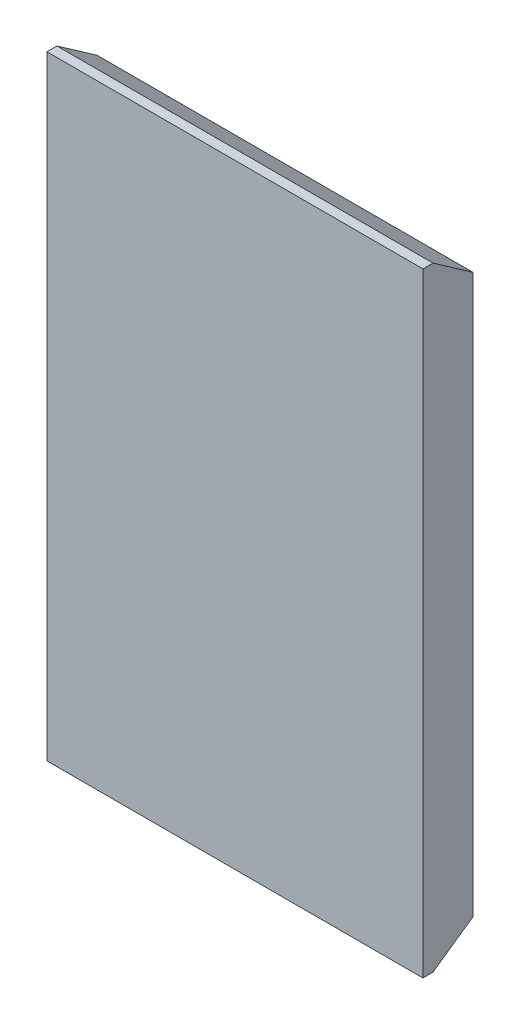
ISO-10303-21;
HEADER;
FILE_DESCRIPTION(('STEP AP214'),'2;1');
FILE_NAME('part.step','',(''),(''),'','','');
FILE_SCHEMA(('AUTOMOTIVE_DESIGN { 1 0 10303 214 1 1 1 1 }'));
ENDSEC;
DATA;
#1=APPLICATION_CONTEXT('core data for automotive mechanical design processes');
#2=APPLICATION_PROTOCOL_DEFINITION('international standard','automotive_design',2000,#1);
#3=PRODUCT_CONTEXT('',#1,'mechanical');
#4=PRODUCT('Part','Part','',(#3));
#5=PRODUCT_RELATED_PRODUCT_CATEGORY('part','',(#4));
#6=PRODUCT_DEFINITION_FORMATION('','',#4);
#7=PRODUCT_DEFINITION_CONTEXT('part definition',#1,'design');
#8=PRODUCT_DEFINITION('design','',#6,#7);
#9=PRODUCT_DEFINITION_SHAPE('','',#8);
#10=(LENGTH_UNIT() NAMED_UNIT(*) SI_UNIT(.MILLI.,.METRE.));
#11=(NAMED_UNIT(*) PLANE_ANGLE_UNIT() SI_UNIT($,.RADIAN.));
#12=(NAMED_UNIT(*) SI_UNIT($,.STERADIAN.) SOLID_ANGLE_UNIT());
#13=UNCERTAINTY_MEASURE_WITH_UNIT(LENGTH_MEASURE(1.E-05),#10,'distance_accuracy_value','');
#14=(GEOMETRIC_REPRESENTATION_CONTEXT(3) GLOBAL_UNCERTAINTY_ASSIGNED_CONTEXT((#13)) GLOBAL_UNIT_ASSIGNED_CONTEXT((#10,
#11,#12)) REPRESENTATION_CONTEXT('',''));
#15=CARTESIAN_POINT('',(0.,0.,0.));
#16=DIRECTION('',(0.,0.,1.));
#17=DIRECTION('',(1.,0.,0.));
#18=AXIS2_PLACEMENT_3D('',#15,#16,#17);
#19=CARTESIAN_POINT('',(75.,122.5,-20.));
#20=DIRECTION('',(1.,0.,0.));
#21=DIRECTION('',(0.,1.,0.));
#22=AXIS2_PLACEMENT_3D('',#19,#20,#21);
#23=PLANE('',#22);
#24=DIRECTION('',(0.,0.,1.));
#25=VECTOR('',#24,1.);
#26=CARTESIAN_POINT('',(75.,-122.5,-20.));
#27=LINE('',#26,#25);
#28=CARTESIAN_POINT('',(75.,-122.5,-3.99999999999996));
#29=VERTEX_POINT('',#28);
#30=CARTESIAN_POINT('',(75.,-122.5,0.));
#31=VERTEX_POINT('',#30);
#32=EDGE_CURVE('E122',#29,#31,#27,.T.);
#33=ORIENTED_EDGE('',*,*,#32,.F.);
#34=DIRECTION('',(0.,0.573576436351044,-0.819152044288993));
#35=VECTOR('',#34,1.);
#36=CARTESIAN_POINT('',(75.,-34.3799265911078,-129.848507192879));
#37=LINE('',#36,#35);
#38=CARTESIAN_POINT('',(75.,-111.296679388645,-20.));
#39=VERTEX_POINT('',#38);
#40=EDGE_CURVE('E61',#29,#39,#37,.T.);
#41=ORIENTED_EDGE('',*,*,#40,.T.);
#42=DIRECTION('',(0.,1.,0.));
#43=VECTOR('',#42,1.);
#44=CARTESIAN_POINT('',(75.,122.5,-20.));
#45=LINE('',#44,#43);
#46=CARTESIAN_POINT('',(75.,111.296679388645,-20.));
#47=VERTEX_POINT('',#46);
#48=EDGE_CURVE('E121',#39,#47,#45,.T.);
#49=ORIENTED_EDGE('',*,*,#48,.T.);
#50=DIRECTION('',(0.,0.573576436351044,0.819152044288993));
#51=VECTOR('',#50,1.);
#52=CARTESIAN_POINT('',(75.,114.982459033713,-14.7361611466054));
#53=LINE('',#52,#51);
#54=CARTESIAN_POINT('',(75.,122.5,-3.99999999999996));
#55=VERTEX_POINT('',#54);
#56=EDGE_CURVE('E96',#47,#55,#53,.T.);
#57=ORIENTED_EDGE('',*,*,#56,.T.);
#58=DIRECTION('',(0.,0.,1.));
#59=VECTOR('',#58,1.);
#60=CARTESIAN_POINT('',(75.,122.5,-20.));
#61=LINE('',#60,#59);
#62=CARTESIAN_POINT('',(75.,122.5,0.));
#63=VERTEX_POINT('',#62);
#64=EDGE_CURVE('E90',#55,#63,#61,.T.);
#65=ORIENTED_EDGE('',*,*,#64,.T.);
#66=DIRECTION('',(0.,1.,0.));
#67=VECTOR('',#66,1.);
#68=CARTESIAN_POINT('',(75.,122.5,0.));
#69=LINE('',#68,#67);
#70=EDGE_CURVE('E93',#31,#63,#69,.T.);
#71=ORIENTED_EDGE('',*,*,#70,.F.);
#72=EDGE_LOOP('',(#33,#41,#49,#57,#65,#71));
#73=FACE_BOUND('',#72,.T.);
#74=ADVANCED_FACE('F39',(#73),#23,.T.);
#75=CARTESIAN_POINT('',(-75.,-122.5,-20.));
#76=DIRECTION('',(0.,-1.,0.));
#77=DIRECTION('',(0.,0.,-1.));
#78=AXIS2_PLACEMENT_3D('',#75,#76,#77);
#79=PLANE('',#78);
#80=DIRECTION('',(0.,0.,1.));
#81=VECTOR('',#80,1.);
#82=CARTESIAN_POINT('',(-75.,-122.5,-20.));
#83=LINE('',#82,#81);
#84=CARTESIAN_POINT('',(-75.,-122.5,-3.99999999999996));
#85=VERTEX_POINT('',#84);
#86=CARTESIAN_POINT('',(-75.,-122.5,0.));
#87=VERTEX_POINT('',#86);
#88=EDGE_CURVE('E125',#85,#87,#83,.T.);
#89=ORIENTED_EDGE('',*,*,#88,.F.);
#90=DIRECTION('',(1.,0.,0.));
#91=VECTOR('',#90,1.);
#92=CARTESIAN_POINT('',(75.,-122.5,-3.99999999999996));
#93=LINE('',#92,#91);
#94=EDGE_CURVE('E135',#85,#29,#93,.T.);
#95=ORIENTED_EDGE('',*,*,#94,.T.);
#96=ORIENTED_EDGE('',*,*,#32,.T.);
#97=DIRECTION('',(1.,0.,0.));
#98=VECTOR('',#97,1.);
#99=CARTESIAN_POINT('',(-75.,-122.5,0.));
#100=LINE('',#99,#98);
#101=EDGE_CURVE('E114',#87,#31,#100,.T.);
#102=ORIENTED_EDGE('',*,*,#101,.F.);
#103=EDGE_LOOP('',(#89,#95,#96,#102));
#104=FACE_BOUND('',#103,.T.);
#105=ADVANCED_FACE('F141',(#104),#79,.T.);
#106=CARTESIAN_POINT('',(-75.,122.5,-20.));
#107=DIRECTION('',(-1.,0.,0.));
#108=DIRECTION('',(0.,-1.,0.));
#109=AXIS2_PLACEMENT_3D('',#106,#107,#108);
#110=PLANE('',#109);
#111=DIRECTION('',(0.,-1.,0.));
#112=VECTOR('',#111,1.);
#113=CARTESIAN_POINT('',(-75.,122.5,-20.));
#114=LINE('',#113,#112);
#115=CARTESIAN_POINT('',(-75.,111.296679388645,-20.));
#116=VERTEX_POINT('',#115);
#117=CARTESIAN_POINT('',(-75.,-111.296679388645,-20.));
#118=VERTEX_POINT('',#117);
#119=EDGE_CURVE('E101',#116,#118,#114,.T.);
#120=ORIENTED_EDGE('',*,*,#119,.T.);
#121=DIRECTION('',(0.,-0.573576436351044,0.819152044288993));
#122=VECTOR('',#121,1.);
#123=CARTESIAN_POINT('',(-75.,-34.3799265911078,-129.848507192879));
#124=LINE('',#123,#122);
#125=EDGE_CURVE('E11',#118,#85,#124,.T.);
#126=ORIENTED_EDGE('',*,*,#125,.T.);
#127=ORIENTED_EDGE('',*,*,#88,.T.);
#128=DIRECTION('',(0.,-1.,0.));
#129=VECTOR('',#128,1.);
#130=CARTESIAN_POINT('',(-75.,122.5,0.));
#131=LINE('',#130,#129);
#132=CARTESIAN_POINT('',(-75.,122.5,0.));
#133=VERTEX_POINT('',#132);
#134=EDGE_CURVE('E110',#133,#87,#131,.T.);
#135=ORIENTED_EDGE('',*,*,#134,.F.);
#136=DIRECTION('',(0.,0.,1.));
#137=VECTOR('',#136,1.);
#138=CARTESIAN_POINT('',(-75.,122.5,-20.));
#139=LINE('',#138,#137);
#140=CARTESIAN_POINT('',(-75.,122.5,-3.99999999999996));
#141=VERTEX_POINT('',#140);
#142=EDGE_CURVE('E100',#141,#133,#139,.T.);
#143=ORIENTED_EDGE('',*,*,#142,.F.);
#144=DIRECTION('',(0.,-0.573576436351044,-0.819152044288993));
#145=VECTOR('',#144,1.);
#146=CARTESIAN_POINT('',(-75.,114.982459033713,-14.7361611466054));
#147=LINE('',#146,#145);
#148=EDGE_CURVE('E129',#141,#116,#147,.T.);
#149=ORIENTED_EDGE('',*,*,#148,.T.);
#150=EDGE_LOOP('',(#120,#126,#127,#135,#143,#149));
#151=FACE_BOUND('',#150,.T.);
#152=ADVANCED_FACE('F145',(#151),#110,.T.);
#153=CARTESIAN_POINT('',(-75.,122.5,-20.));
#154=DIRECTION('',(0.,1.,0.));
#155=DIRECTION('',(0.,0.,1.));
#156=AXIS2_PLACEMENT_3D('',#153,#154,#155);
#157=PLANE('',#156);
#158=ORIENTED_EDGE('',*,*,#64,.F.);
#159=DIRECTION('',(-1.,0.,0.));
#160=VECTOR('',#159,1.);
#161=CARTESIAN_POINT('',(-75.,122.5,-3.99999999999996));
#162=LINE('',#161,#160);
#163=EDGE_CURVE('E124',#55,#141,#162,.T.);
#164=ORIENTED_EDGE('',*,*,#163,.T.);
#165=ORIENTED_EDGE('',*,*,#142,.T.);
#166=DIRECTION('',(-1.,0.,0.));
#167=VECTOR('',#166,1.);
#168=CARTESIAN_POINT('',(-75.,122.5,0.));
#169=LINE('',#168,#167);
#170=EDGE_CURVE('E104',#63,#133,#169,.T.);
#171=ORIENTED_EDGE('',*,*,#170,.F.);
#172=EDGE_LOOP('',(#158,#164,#165,#171));
#173=FACE_BOUND('',#172,.T.);
#174=ADVANCED_FACE('F105',(#173),#157,.T.);
#175=CARTESIAN_POINT('',(0.,0.,-20.));
#176=DIRECTION('',(0.,0.,1.));
#177=DIRECTION('',(1.,0.,0.));
#178=AXIS2_PLACEMENT_3D('',#175,#176,#177);
#179=PLANE('',#178);
#180=ORIENTED_EDGE('',*,*,#48,.F.);
#181=DIRECTION('',(-1.,0.,0.));
#182=VECTOR('',#181,1.);
#183=CARTESIAN_POINT('',(-75.,-111.296679388645,-20.));
#184=LINE('',#183,#182);
#185=EDGE_CURVE('E47',#39,#118,#184,.T.);
#186=ORIENTED_EDGE('',*,*,#185,.T.);
#187=ORIENTED_EDGE('',*,*,#119,.F.);
#188=DIRECTION('',(1.,0.,0.));
#189=VECTOR('',#188,1.);
#190=CARTESIAN_POINT('',(75.,111.296679388645,-20.));
#191=LINE('',#190,#189);
#192=EDGE_CURVE('E131',#116,#47,#191,.T.);
#193=ORIENTED_EDGE('',*,*,#192,.T.);
#194=EDGE_LOOP('',(#180,#186,#187,#193));
#195=FACE_BOUND('',#194,.T.);
#196=ADVANCED_FACE('F147',(#195),#179,.F.);
#197=CARTESIAN_POINT('',(0.,0.,0.));
#198=DIRECTION('',(0.,0.,1.));
#199=DIRECTION('',(1.,0.,0.));
#200=AXIS2_PLACEMENT_3D('',#197,#198,#199);
#201=PLANE('',#200);
#202=ORIENTED_EDGE('',*,*,#70,.T.);
#203=ORIENTED_EDGE('',*,*,#170,.T.);
#204=ORIENTED_EDGE('',*,*,#134,.T.);
#205=ORIENTED_EDGE('',*,*,#101,.T.);
#206=EDGE_LOOP('',(#202,#203,#204,#205));
#207=FACE_BOUND('',#206,.T.);
#208=ADVANCED_FACE('F112',(#207),#201,.T.);
#209=CARTESIAN_POINT('',(-75.,122.5,-3.99999999999996));
#210=DIRECTION('',(0.,0.819152044288994,-0.573576436351044));
#211=DIRECTION('',(1.,0.,0.));
#212=AXIS2_PLACEMENT_3D('',#209,#210,#211);
#213=PLANE('',#212);
#214=ORIENTED_EDGE('',*,*,#56,.F.);
#215=ORIENTED_EDGE('',*,*,#192,.F.);
#216=ORIENTED_EDGE('',*,*,#148,.F.);
#217=ORIENTED_EDGE('',*,*,#163,.F.);
#218=EDGE_LOOP('',(#214,#215,#216,#217));
#219=FACE_BOUND('',#218,.T.);
#220=ADVANCED_FACE('F149',(#219),#213,.T.);
#221=CARTESIAN_POINT('',(-75.,-122.5,-3.99999999999996));
#222=DIRECTION('',(0.,-0.819152044288994,-0.573576436351044));
#223=DIRECTION('',(-1.,0.,0.));
#224=AXIS2_PLACEMENT_3D('',#221,#222,#223);
#225=PLANE('',#224);
#226=ORIENTED_EDGE('',*,*,#125,.F.);
#227=ORIENTED_EDGE('',*,*,#185,.F.);
#228=ORIENTED_EDGE('',*,*,#40,.F.);
#229=ORIENTED_EDGE('',*,*,#94,.F.);
#230=EDGE_LOOP('',(#226,#227,#228,#229));
#231=FACE_BOUND('',#230,.T.);
#232=ADVANCED_FACE('F41',(#231),#225,.T.);
#233=CLOSED_SHELL('',(#74,#105,#152,#174,#196,#208,#220,#232));
#234=MANIFOLD_SOLID_BREP('B2',#233);
#235=ADVANCED_BREP_SHAPE_REPRESENTATION('',(#18,#234),#14);
#236=SHAPE_DEFINITION_REPRESENTATION(#9,#235);
ENDSEC;
END-ISO-10303-21;
